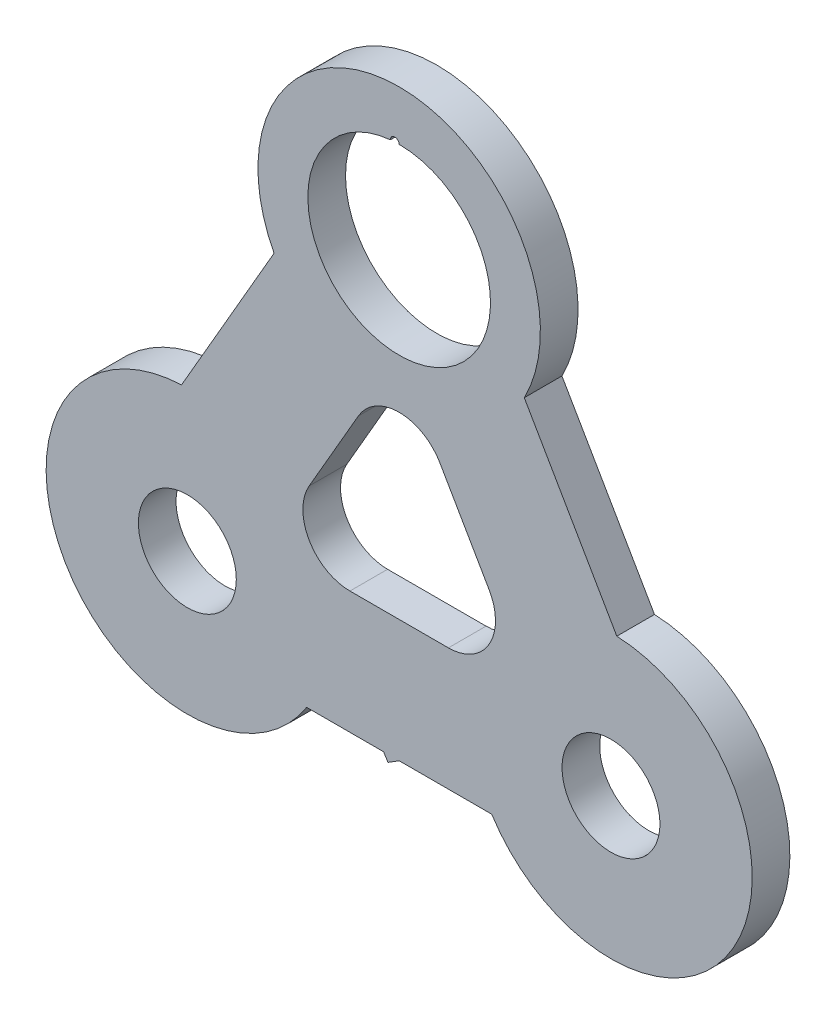
ISO-10303-21;
HEADER;
FILE_DESCRIPTION(('STEP AP214'),'2;1');
FILE_NAME('part.step','',(''),(''),'','','');
FILE_SCHEMA(('AUTOMOTIVE_DESIGN { 1 0 10303 214 1 1 1 1 }'));
ENDSEC;
DATA;
#1=APPLICATION_CONTEXT('core data for automotive mechanical design processes');
#2=APPLICATION_PROTOCOL_DEFINITION('international standard','automotive_design',2000,#1);
#3=PRODUCT_CONTEXT('',#1,'mechanical');
#4=PRODUCT('Part','Part','',(#3));
#5=PRODUCT_RELATED_PRODUCT_CATEGORY('part','',(#4));
#6=PRODUCT_DEFINITION_FORMATION('','',#4);
#7=PRODUCT_DEFINITION_CONTEXT('part definition',#1,'design');
#8=PRODUCT_DEFINITION('design','',#6,#7);
#9=PRODUCT_DEFINITION_SHAPE('','',#8);
#10=(LENGTH_UNIT() NAMED_UNIT(*) SI_UNIT(.MILLI.,.METRE.));
#11=(NAMED_UNIT(*) PLANE_ANGLE_UNIT() SI_UNIT($,.RADIAN.));
#12=(NAMED_UNIT(*) SI_UNIT($,.STERADIAN.) SOLID_ANGLE_UNIT());
#13=UNCERTAINTY_MEASURE_WITH_UNIT(LENGTH_MEASURE(1.E-05),#10,'distance_accuracy_value','');
#14=(GEOMETRIC_REPRESENTATION_CONTEXT(3) GLOBAL_UNCERTAINTY_ASSIGNED_CONTEXT((#13)) GLOBAL_UNIT_ASSIGNED_CONTEXT((#10,
#11,#12)) REPRESENTATION_CONTEXT('',''));
#15=CARTESIAN_POINT('',(0.,0.,0.));
#16=DIRECTION('',(0.,0.,1.));
#17=DIRECTION('',(1.,0.,0.));
#18=AXIS2_PLACEMENT_3D('',#15,#16,#17);
#19=CARTESIAN_POINT('',(-0.291428571428643,20.2141430137214,4.));
#20=DIRECTION('',(0.,0.,1.));
#21=DIRECTION('',(1.,0.,0.));
#22=AXIS2_PLACEMENT_3D('',#19,#20,#21);
#23=PLANE('',#22);
#24=CARTESIAN_POINT('',(-0.291428571428611,20.2141430137213,4.));
#25=DIRECTION('',(0.,0.,1.));
#26=DIRECTION('',(1.,0.,0.));
#27=AXIS2_PLACEMENT_3D('',#24,#25,#26);
#28=CIRCLE('',#27,9.70000000000008);
#29=CARTESIAN_POINT('',(-1.21777852383291,29.8698084887511,4.));
#30=VERTEX_POINT('',#29);
#31=CARTESIAN_POINT('',(-0.29142857142864,29.9141430137214,4.));
#32=VERTEX_POINT('',#31);
#33=EDGE_CURVE('E55',#30,#32,#28,.T.);
#34=ORIENTED_EDGE('',*,*,#33,.F.);
#35=CARTESIAN_POINT('',(-0.754603547630773,29.8919757512362,4.));
#36=DIRECTION('',(0.,0.,1.));
#37=DIRECTION('',(1.,0.,0.));
#38=AXIS2_PLACEMENT_3D('',#35,#36,#37);
#39=CIRCLE('',#38,0.463705128401587);
#40=EDGE_CURVE('E173',#32,#30,#39,.T.);
#41=ORIENTED_EDGE('',*,*,#40,.F.);
#42=EDGE_LOOP('',(#34,#41));
#43=FACE_BOUND('',#42,.T.);
#44=CARTESIAN_POINT('',(22.2085714285714,-18.7570001565784,4.));
#45=DIRECTION('',(0.,0.,1.));
#46=DIRECTION('',(1.,0.,0.));
#47=AXIS2_PLACEMENT_3D('',#44,#45,#46);
#48=CIRCLE('',#47,5.2);
#49=CARTESIAN_POINT('',(27.4085714285714,-18.7570001565784,4.));
#50=VERTEX_POINT('',#49);
#51=EDGE_CURVE('E254',#50,#50,#48,.T.);
#52=ORIENTED_EDGE('',*,*,#51,.F.);
#53=EDGE_LOOP('',(#52));
#54=FACE_BOUND('',#53,.T.);
#55=DIRECTION('',(-0.500000000000004,-0.866025403784436,0.));
#56=VECTOR('',#55,1.);
#57=CARTESIAN_POINT('',(-18.4946225492973,4.74299984342158,4.));
#58=LINE('',#57,#56);
#59=CARTESIAN_POINT('',(-13.579791410665,13.2557370861542,4.));
#60=VERTEX_POINT('',#59);
#61=CARTESIAN_POINT('',(-23.4094536879295,-3.76973739931099,4.));
#62=VERTEX_POINT('',#61);
#63=EDGE_CURVE('E262',#60,#62,#58,.T.);
#64=ORIENTED_EDGE('',*,*,#63,.T.);
#65=CARTESIAN_POINT('',(-22.7914285714286,-18.7570001565784,4.));
#66=DIRECTION('',(0.,0.,1.));
#67=DIRECTION('',(-1.,0.,0.));
#68=AXIS2_PLACEMENT_3D('',#65,#66,#67);
#69=CIRCLE('',#68,15.);
#70=CARTESIAN_POINT('',(-10.1210908486931,-26.7858569862786,4.));
#71=VERTEX_POINT('',#70);
#72=EDGE_CURVE('E265',#62,#71,#69,.T.);
#73=ORIENTED_EDGE('',*,*,#72,.T.);
#74=DIRECTION('',(1.,0.,0.));
#75=VECTOR('',#74,1.);
#76=CARTESIAN_POINT('',(-1.94731162959737,-26.7858569862786,4.));
#77=LINE('',#76,#75);
#78=CARTESIAN_POINT('',(-1.94731162959737,-26.7858569862786,4.));
#79=VERTEX_POINT('',#78);
#80=EDGE_CURVE('E269',#71,#79,#77,.T.);
#81=ORIENTED_EDGE('',*,*,#80,.T.);
#82=DIRECTION('',(0.531337840176272,-0.847160020065168,0.));
#83=VECTOR('',#82,1.);
#84=CARTESIAN_POINT('',(-1.47982288953585,-27.531216605837,4.));
#85=LINE('',#84,#83);
#86=CARTESIAN_POINT('',(-1.47982288953585,-27.531216605837,4.));
#87=VERTEX_POINT('',#86);
#88=EDGE_CURVE('E272',#79,#87,#85,.T.);
#89=ORIENTED_EDGE('',*,*,#88,.T.);
#90=DIRECTION('',(0.847160020065167,0.531337840176272,0.));
#91=VECTOR('',#90,1.);
#92=CARTESIAN_POINT('',(-0.291428571428633,-26.7858569862786,4.));
#93=LINE('',#92,#91);
#94=CARTESIAN_POINT('',(-0.291428571428633,-26.7858569862786,4.));
#95=VERTEX_POINT('',#94);
#96=EDGE_CURVE('E275',#87,#95,#93,.T.);
#97=ORIENTED_EDGE('',*,*,#96,.T.);
#98=DIRECTION('',(1.,0.,0.));
#99=VECTOR('',#98,1.);
#100=CARTESIAN_POINT('',(-0.291428571428633,-26.7858569862786,4.));
#101=LINE('',#100,#99);
#102=CARTESIAN_POINT('',(9.53823370583582,-26.7858569862786,4.));
#103=VERTEX_POINT('',#102);
#104=EDGE_CURVE('E278',#95,#103,#101,.T.);
#105=ORIENTED_EDGE('',*,*,#104,.T.);
#106=CARTESIAN_POINT('',(22.2085714285715,-18.7570001565784,4.));
#107=DIRECTION('',(0.,0.,1.));
#108=DIRECTION('',(-1.,0.,0.));
#109=AXIS2_PLACEMENT_3D('',#106,#107,#108);
#110=CIRCLE('',#109,15.0000000000001);
#111=CARTESIAN_POINT('',(22.8265965450723,-3.76973739931098,4.));
#112=VERTEX_POINT('',#111);
#113=EDGE_CURVE('E281',#103,#112,#110,.T.);
#114=ORIENTED_EDGE('',*,*,#113,.T.);
#115=DIRECTION('',(-0.500000000000005,0.866025403784436,0.));
#116=VECTOR('',#115,1.);
#117=CARTESIAN_POINT('',(17.91176540644,4.74299984342158,4.));
#118=LINE('',#117,#116);
#119=CARTESIAN_POINT('',(12.9969342678077,13.2557370861542,4.));
#120=VERTEX_POINT('',#119);
#121=EDGE_CURVE('E284',#112,#120,#118,.T.);
#122=ORIENTED_EDGE('',*,*,#121,.T.);
#123=CARTESIAN_POINT('',(-0.291428571428643,20.2141430137214,4.));
#124=DIRECTION('',(0.,0.,1.));
#125=DIRECTION('',(1.,0.,0.));
#126=AXIS2_PLACEMENT_3D('',#123,#124,#125);
#127=CIRCLE('',#126,15.);
#128=EDGE_CURVE('E287',#120,#60,#127,.T.);
#129=ORIENTED_EDGE('',*,*,#128,.T.);
#130=EDGE_LOOP('',(#64,#73,#81,#89,#97,#105,#114,#122,#129));
#131=FACE_BOUND('',#130,.T.);
#132=CARTESIAN_POINT('',(-22.7914285714286,-18.7570001565784,4.));
#133=DIRECTION('',(0.,0.,1.));
#134=DIRECTION('',(1.,0.,0.));
#135=AXIS2_PLACEMENT_3D('',#132,#133,#134);
#136=CIRCLE('',#135,5.2);
#137=CARTESIAN_POINT('',(-17.5914285714286,-18.7570001565784,4.));
#138=VERTEX_POINT('',#137);
#139=EDGE_CURVE('E246',#138,#138,#136,.T.);
#140=ORIENTED_EDGE('',*,*,#139,.F.);
#141=EDGE_LOOP('',(#140));
#142=FACE_BOUND('',#141,.T.);
#143=DIRECTION('',(-0.500000000000004,0.866025403784436,0.));
#144=VECTOR('',#143,1.);
#145=CARTESIAN_POINT('',(9.26817186699101,-6.28585698627862,4.));
#146=LINE('',#145,#144);
#147=CARTESIAN_POINT('',(9.26817186699101,-6.28585698627862,4.));
#148=VERTEX_POINT('',#147);
#149=CARTESIAN_POINT('',(4.03869844749354,2.77185667312186,4.));
#150=VERTEX_POINT('',#149);
#151=EDGE_CURVE('E186',#148,#150,#146,.T.);
#152=ORIENTED_EDGE('',*,*,#151,.F.);
#153=CARTESIAN_POINT('',(4.9380448480688,-8.78585698627862,4.));
#154=DIRECTION('',(0.,0.,1.));
#155=DIRECTION('',(1.,0.,0.));
#156=AXIS2_PLACEMENT_3D('',#153,#154,#155);
#157=CIRCLE('',#156,5.00000000000002);
#158=CARTESIAN_POINT('',(4.93804484806883,-13.7858569862786,4.));
#159=VERTEX_POINT('',#158);
#160=EDGE_CURVE('E183',#159,#148,#157,.T.);
#161=ORIENTED_EDGE('',*,*,#160,.F.);
#162=DIRECTION('',(1.,0.,0.));
#163=VECTOR('',#162,1.);
#164=CARTESIAN_POINT('',(4.93804484806883,-13.7858569862786,4.));
#165=LINE('',#164,#163);
#166=CARTESIAN_POINT('',(-5.52090199092611,-13.7858569862786,4.));
#167=VERTEX_POINT('',#166);
#168=EDGE_CURVE('E200',#167,#159,#165,.T.);
#169=ORIENTED_EDGE('',*,*,#168,.F.);
#170=CARTESIAN_POINT('',(-5.5209019909261,-8.78585698627863,4.));
#171=DIRECTION('',(0.,0.,1.));
#172=DIRECTION('',(-1.,0.,0.));
#173=AXIS2_PLACEMENT_3D('',#170,#171,#172);
#174=CIRCLE('',#173,5.);
#175=CARTESIAN_POINT('',(-9.85102900984829,-6.28585698627862,4.));
#176=VERTEX_POINT('',#175);
#177=EDGE_CURVE('E196',#176,#167,#174,.T.);
#178=ORIENTED_EDGE('',*,*,#177,.F.);
#179=DIRECTION('',(-0.500000000000004,-0.866025403784436,0.));
#180=VECTOR('',#179,1.);
#181=CARTESIAN_POINT('',(-4.62155559035082,2.77185667312185,4.));
#182=LINE('',#181,#180);
#183=CARTESIAN_POINT('',(-4.62155559035083,2.77185667312185,4.));
#184=VERTEX_POINT('',#183);
#185=EDGE_CURVE('E193',#184,#176,#182,.T.);
#186=ORIENTED_EDGE('',*,*,#185,.F.);
#187=CARTESIAN_POINT('',(-0.291428571428639,0.271856673121823,4.));
#188=DIRECTION('',(0.,0.,1.));
#189=DIRECTION('',(1.,0.,0.));
#190=AXIS2_PLACEMENT_3D('',#187,#188,#189);
#191=CIRCLE('',#190,5.00000000000001);
#192=EDGE_CURVE('E190',#150,#184,#191,.T.);
#193=ORIENTED_EDGE('',*,*,#192,.F.);
#194=EDGE_LOOP('',(#152,#161,#169,#178,#186,#193));
#195=FACE_BOUND('',#194,.T.);
#196=ADVANCED_FACE('F39',(#43,#54,#131,#142,#195),#23,.T.);
#197=CARTESIAN_POINT('',(-0.291428571428643,20.2141430137214,0.));
#198=DIRECTION('',(0.,0.,1.));
#199=DIRECTION('',(1.,0.,0.));
#200=AXIS2_PLACEMENT_3D('',#197,#198,#199);
#201=PLANE('',#200);
#202=CARTESIAN_POINT('',(-0.754603547630773,29.8919757512362,0.));
#203=DIRECTION('',(0.,0.,1.));
#204=DIRECTION('',(1.,0.,0.));
#205=AXIS2_PLACEMENT_3D('',#202,#203,#204);
#206=CIRCLE('',#205,0.463705128401587);
#207=CARTESIAN_POINT('',(-0.29142857142864,29.9141430137214,0.));
#208=VERTEX_POINT('',#207);
#209=CARTESIAN_POINT('',(-1.21777852383291,29.8698084887511,0.));
#210=VERTEX_POINT('',#209);
#211=EDGE_CURVE('E163',#208,#210,#206,.T.);
#212=ORIENTED_EDGE('',*,*,#211,.T.);
#213=CARTESIAN_POINT('',(-0.291428571428611,20.2141430137213,0.));
#214=DIRECTION('',(0.,0.,1.));
#215=DIRECTION('',(1.,0.,0.));
#216=AXIS2_PLACEMENT_3D('',#213,#214,#215);
#217=CIRCLE('',#216,9.70000000000008);
#218=EDGE_CURVE('E60',#210,#208,#217,.T.);
#219=ORIENTED_EDGE('',*,*,#218,.T.);
#220=EDGE_LOOP('',(#212,#219));
#221=FACE_BOUND('',#220,.T.);
#222=CARTESIAN_POINT('',(-22.7914285714286,-18.7570001565784,0.));
#223=DIRECTION('',(0.,0.,1.));
#224=DIRECTION('',(1.,0.,0.));
#225=AXIS2_PLACEMENT_3D('',#222,#223,#224);
#226=CIRCLE('',#225,5.2);
#227=CARTESIAN_POINT('',(-17.5914285714286,-18.7570001565784,0.));
#228=VERTEX_POINT('',#227);
#229=EDGE_CURVE('E245',#228,#228,#226,.T.);
#230=ORIENTED_EDGE('',*,*,#229,.T.);
#231=EDGE_LOOP('',(#230));
#232=FACE_BOUND('',#231,.T.);
#233=CARTESIAN_POINT('',(22.2085714285714,-18.7570001565784,0.));
#234=DIRECTION('',(0.,0.,1.));
#235=DIRECTION('',(1.,0.,0.));
#236=AXIS2_PLACEMENT_3D('',#233,#234,#235);
#237=CIRCLE('',#236,5.2);
#238=CARTESIAN_POINT('',(27.4085714285714,-18.7570001565784,0.));
#239=VERTEX_POINT('',#238);
#240=EDGE_CURVE('E250',#239,#239,#237,.T.);
#241=ORIENTED_EDGE('',*,*,#240,.T.);
#242=EDGE_LOOP('',(#241));
#243=FACE_BOUND('',#242,.T.);
#244=DIRECTION('',(-0.500000000000004,-0.866025403784436,0.));
#245=VECTOR('',#244,1.);
#246=CARTESIAN_POINT('',(-18.4946225492973,4.74299984342158,0.));
#247=LINE('',#246,#245);
#248=CARTESIAN_POINT('',(-13.579791410665,13.2557370861542,0.));
#249=VERTEX_POINT('',#248);
#250=CARTESIAN_POINT('',(-23.4094536879295,-3.76973739931099,0.));
#251=VERTEX_POINT('',#250);
#252=EDGE_CURVE('E258',#249,#251,#247,.T.);
#253=ORIENTED_EDGE('',*,*,#252,.F.);
#254=CARTESIAN_POINT('',(-0.291428571428643,20.2141430137214,0.));
#255=DIRECTION('',(0.,0.,1.));
#256=DIRECTION('',(1.,0.,0.));
#257=AXIS2_PLACEMENT_3D('',#254,#255,#256);
#258=CIRCLE('',#257,15.);
#259=CARTESIAN_POINT('',(12.9969342678077,13.2557370861542,0.));
#260=VERTEX_POINT('',#259);
#261=EDGE_CURVE('E266',#260,#249,#258,.T.);
#262=ORIENTED_EDGE('',*,*,#261,.F.);
#263=DIRECTION('',(-0.500000000000005,0.866025403784436,0.));
#264=VECTOR('',#263,1.);
#265=CARTESIAN_POINT('',(17.91176540644,4.74299984342158,0.));
#266=LINE('',#265,#264);
#267=CARTESIAN_POINT('',(22.8265965450723,-3.76973739931098,0.));
#268=VERTEX_POINT('',#267);
#269=EDGE_CURVE('E312',#268,#260,#266,.T.);
#270=ORIENTED_EDGE('',*,*,#269,.F.);
#271=CARTESIAN_POINT('',(22.2085714285715,-18.7570001565784,0.));
#272=DIRECTION('',(0.,0.,1.));
#273=DIRECTION('',(-1.,0.,0.));
#274=AXIS2_PLACEMENT_3D('',#271,#272,#273);
#275=CIRCLE('',#274,15.0000000000001);
#276=CARTESIAN_POINT('',(9.53823370583582,-26.7858569862786,0.));
#277=VERTEX_POINT('',#276);
#278=EDGE_CURVE('E308',#277,#268,#275,.T.);
#279=ORIENTED_EDGE('',*,*,#278,.F.);
#280=DIRECTION('',(1.,0.,0.));
#281=VECTOR('',#280,1.);
#282=CARTESIAN_POINT('',(-0.291428571428633,-26.7858569862786,0.));
#283=LINE('',#282,#281);
#284=CARTESIAN_POINT('',(-0.291428571428633,-26.7858569862786,0.));
#285=VERTEX_POINT('',#284);
#286=EDGE_CURVE('E305',#285,#277,#283,.T.);
#287=ORIENTED_EDGE('',*,*,#286,.F.);
#288=DIRECTION('',(0.847160020065167,0.531337840176272,0.));
#289=VECTOR('',#288,1.);
#290=CARTESIAN_POINT('',(-0.291428571428633,-26.7858569862786,0.));
#291=LINE('',#290,#289);
#292=CARTESIAN_POINT('',(-1.47982288953585,-27.531216605837,0.));
#293=VERTEX_POINT('',#292);
#294=EDGE_CURVE('E302',#293,#285,#291,.T.);
#295=ORIENTED_EDGE('',*,*,#294,.F.);
#296=DIRECTION('',(0.531337840176272,-0.847160020065168,0.));
#297=VECTOR('',#296,1.);
#298=CARTESIAN_POINT('',(-1.47982288953585,-27.531216605837,0.));
#299=LINE('',#298,#297);
#300=CARTESIAN_POINT('',(-1.94731162959737,-26.7858569862786,0.));
#301=VERTEX_POINT('',#300);
#302=EDGE_CURVE('E299',#301,#293,#299,.T.);
#303=ORIENTED_EDGE('',*,*,#302,.F.);
#304=DIRECTION('',(1.,0.,0.));
#305=VECTOR('',#304,1.);
#306=CARTESIAN_POINT('',(-1.94731162959737,-26.7858569862786,0.));
#307=LINE('',#306,#305);
#308=CARTESIAN_POINT('',(-10.1210908486931,-26.7858569862786,0.));
#309=VERTEX_POINT('',#308);
#310=EDGE_CURVE('E296',#309,#301,#307,.T.);
#311=ORIENTED_EDGE('',*,*,#310,.F.);
#312=CARTESIAN_POINT('',(-22.7914285714286,-18.7570001565784,0.));
#313=DIRECTION('',(0.,0.,1.));
#314=DIRECTION('',(-1.,0.,0.));
#315=AXIS2_PLACEMENT_3D('',#312,#313,#314);
#316=CIRCLE('',#315,15.);
#317=EDGE_CURVE('E293',#251,#309,#316,.T.);
#318=ORIENTED_EDGE('',*,*,#317,.F.);
#319=EDGE_LOOP('',(#253,#262,#270,#279,#287,#295,#303,#311,#318));
#320=FACE_BOUND('',#319,.T.);
#321=CARTESIAN_POINT('',(4.9380448480688,-8.78585698627862,0.));
#322=DIRECTION('',(0.,0.,1.));
#323=DIRECTION('',(1.,0.,0.));
#324=AXIS2_PLACEMENT_3D('',#321,#322,#323);
#325=CIRCLE('',#324,5.00000000000002);
#326=CARTESIAN_POINT('',(4.93804484806883,-13.7858569862786,0.));
#327=VERTEX_POINT('',#326);
#328=CARTESIAN_POINT('',(9.26817186699101,-6.28585698627862,0.));
#329=VERTEX_POINT('',#328);
#330=EDGE_CURVE('E181',#327,#329,#325,.T.);
#331=ORIENTED_EDGE('',*,*,#330,.T.);
#332=DIRECTION('',(-0.500000000000004,0.866025403784436,0.));
#333=VECTOR('',#332,1.);
#334=CARTESIAN_POINT('',(9.26817186699101,-6.28585698627862,0.));
#335=LINE('',#334,#333);
#336=CARTESIAN_POINT('',(4.03869844749354,2.77185667312186,0.));
#337=VERTEX_POINT('',#336);
#338=EDGE_CURVE('E207',#329,#337,#335,.T.);
#339=ORIENTED_EDGE('',*,*,#338,.T.);
#340=CARTESIAN_POINT('',(-0.291428571428639,0.271856673121823,0.));
#341=DIRECTION('',(0.,0.,1.));
#342=DIRECTION('',(1.,0.,0.));
#343=AXIS2_PLACEMENT_3D('',#340,#341,#342);
#344=CIRCLE('',#343,5.00000000000001);
#345=CARTESIAN_POINT('',(-4.62155559035083,2.77185667312185,0.));
#346=VERTEX_POINT('',#345);
#347=EDGE_CURVE('E211',#337,#346,#344,.T.);
#348=ORIENTED_EDGE('',*,*,#347,.T.);
#349=DIRECTION('',(-0.500000000000004,-0.866025403784436,0.));
#350=VECTOR('',#349,1.);
#351=CARTESIAN_POINT('',(-4.62155559035082,2.77185667312185,0.));
#352=LINE('',#351,#350);
#353=CARTESIAN_POINT('',(-9.85102900984829,-6.28585698627862,0.));
#354=VERTEX_POINT('',#353);
#355=EDGE_CURVE('E215',#346,#354,#352,.T.);
#356=ORIENTED_EDGE('',*,*,#355,.T.);
#357=CARTESIAN_POINT('',(-5.5209019909261,-8.78585698627863,0.));
#358=DIRECTION('',(0.,0.,1.));
#359=DIRECTION('',(-1.,0.,0.));
#360=AXIS2_PLACEMENT_3D('',#357,#358,#359);
#361=CIRCLE('',#360,5.);
#362=CARTESIAN_POINT('',(-5.52090199092611,-13.7858569862786,0.));
#363=VERTEX_POINT('',#362);
#364=EDGE_CURVE('E219',#354,#363,#361,.T.);
#365=ORIENTED_EDGE('',*,*,#364,.T.);
#366=DIRECTION('',(1.,0.,0.));
#367=VECTOR('',#366,1.);
#368=CARTESIAN_POINT('',(4.93804484806883,-13.7858569862786,0.));
#369=LINE('',#368,#367);
#370=EDGE_CURVE('E187',#363,#327,#369,.T.);
#371=ORIENTED_EDGE('',*,*,#370,.T.);
#372=EDGE_LOOP('',(#331,#339,#348,#356,#365,#371));
#373=FACE_BOUND('',#372,.T.);
#374=ADVANCED_FACE('F170',(#221,#232,#243,#320,#373),#201,.F.);
#375=CARTESIAN_POINT('',(-18.4946225492973,4.74299984342158,4.));
#376=DIRECTION('',(0.866025403784436,-0.500000000000004,0.));
#377=DIRECTION('',(0.500000000000004,0.866025403784436,0.));
#378=AXIS2_PLACEMENT_3D('',#375,#376,#377);
#379=PLANE('',#378);
#380=ORIENTED_EDGE('',*,*,#252,.T.);
#381=DIRECTION('',(0.,0.,-1.));
#382=VECTOR('',#381,1.);
#383=CARTESIAN_POINT('',(-23.4094536879295,-3.76973739931099,4.));
#384=LINE('',#383,#382);
#385=EDGE_CURVE('E11',#62,#251,#384,.T.);
#386=ORIENTED_EDGE('',*,*,#385,.F.);
#387=ORIENTED_EDGE('',*,*,#63,.F.);
#388=DIRECTION('',(0.,0.,-1.));
#389=VECTOR('',#388,1.);
#390=CARTESIAN_POINT('',(-13.579791410665,13.2557370861542,4.));
#391=LINE('',#390,#389);
#392=EDGE_CURVE('E290',#60,#249,#391,.T.);
#393=ORIENTED_EDGE('',*,*,#392,.T.);
#394=EDGE_LOOP('',(#380,#386,#387,#393));
#395=FACE_BOUND('',#394,.T.);
#396=ADVANCED_FACE('F41',(#395),#379,.F.);
#397=CARTESIAN_POINT('',(-22.7914285714286,-18.7570001565784,4.));
#398=DIRECTION('',(0.,0.,-1.));
#399=DIRECTION('',(-1.,0.,0.));
#400=AXIS2_PLACEMENT_3D('',#397,#398,#399);
#401=CYLINDRICAL_SURFACE('',#400,15.);
#402=ORIENTED_EDGE('',*,*,#317,.T.);
#403=DIRECTION('',(0.,0.,-1.));
#404=VECTOR('',#403,1.);
#405=CARTESIAN_POINT('',(-10.1210908486931,-26.7858569862786,4.));
#406=LINE('',#405,#404);
#407=EDGE_CURVE('E48',#71,#309,#406,.T.);
#408=ORIENTED_EDGE('',*,*,#407,.F.);
#409=ORIENTED_EDGE('',*,*,#72,.F.);
#410=ORIENTED_EDGE('',*,*,#385,.T.);
#411=EDGE_LOOP('',(#402,#408,#409,#410));
#412=FACE_BOUND('',#411,.T.);
#413=ADVANCED_FACE('F374',(#412),#401,.T.);
#414=CARTESIAN_POINT('',(-1.94731162959737,-26.7858569862786,4.));
#415=DIRECTION('',(0.,1.,0.));
#416=DIRECTION('',(0.,0.,1.));
#417=AXIS2_PLACEMENT_3D('',#414,#415,#416);
#418=PLANE('',#417);
#419=ORIENTED_EDGE('',*,*,#310,.T.);
#420=DIRECTION('',(0.,0.,-1.));
#421=VECTOR('',#420,1.);
#422=CARTESIAN_POINT('',(-1.94731162959737,-26.7858569862786,4.));
#423=LINE('',#422,#421);
#424=EDGE_CURVE('E341',#79,#301,#423,.T.);
#425=ORIENTED_EDGE('',*,*,#424,.F.);
#426=ORIENTED_EDGE('',*,*,#80,.F.);
#427=ORIENTED_EDGE('',*,*,#407,.T.);
#428=EDGE_LOOP('',(#419,#425,#426,#427));
#429=FACE_BOUND('',#428,.T.);
#430=ADVANCED_FACE('F350',(#429),#418,.F.);
#431=CARTESIAN_POINT('',(-1.47982288953585,-27.531216605837,4.));
#432=DIRECTION('',(0.847160020065167,0.531337840176271,0.));
#433=DIRECTION('',(-0.531337840176272,0.847160020065168,0.));
#434=AXIS2_PLACEMENT_3D('',#431,#432,#433);
#435=PLANE('',#434);
#436=ORIENTED_EDGE('',*,*,#302,.T.);
#437=DIRECTION('',(0.,0.,-1.));
#438=VECTOR('',#437,1.);
#439=CARTESIAN_POINT('',(-1.47982288953585,-27.531216605837,4.));
#440=LINE('',#439,#438);
#441=EDGE_CURVE('E337',#87,#293,#440,.T.);
#442=ORIENTED_EDGE('',*,*,#441,.F.);
#443=ORIENTED_EDGE('',*,*,#88,.F.);
#444=ORIENTED_EDGE('',*,*,#424,.T.);
#445=EDGE_LOOP('',(#436,#442,#443,#444));
#446=FACE_BOUND('',#445,.T.);
#447=ADVANCED_FACE('F362',(#446),#435,.F.);
#448=CARTESIAN_POINT('',(-0.291428571428633,-26.7858569862786,4.));
#449=DIRECTION('',(-0.531337840176272,0.847160020065167,0.));
#450=DIRECTION('',(-0.847160020065167,-0.531337840176272,0.));
#451=AXIS2_PLACEMENT_3D('',#448,#449,#450);
#452=PLANE('',#451);
#453=ORIENTED_EDGE('',*,*,#294,.T.);
#454=DIRECTION('',(0.,0.,-1.));
#455=VECTOR('',#454,1.);
#456=CARTESIAN_POINT('',(-0.291428571428633,-26.7858569862786,4.));
#457=LINE('',#456,#455);
#458=EDGE_CURVE('E333',#95,#285,#457,.T.);
#459=ORIENTED_EDGE('',*,*,#458,.F.);
#460=ORIENTED_EDGE('',*,*,#96,.F.);
#461=ORIENTED_EDGE('',*,*,#441,.T.);
#462=EDGE_LOOP('',(#453,#459,#460,#461));
#463=FACE_BOUND('',#462,.T.);
#464=ADVANCED_FACE('F366',(#463),#452,.F.);
#465=CARTESIAN_POINT('',(-0.291428571428633,-26.7858569862786,4.));
#466=DIRECTION('',(0.,1.,0.));
#467=DIRECTION('',(0.,0.,1.));
#468=AXIS2_PLACEMENT_3D('',#465,#466,#467);
#469=PLANE('',#468);
#470=ORIENTED_EDGE('',*,*,#286,.T.);
#471=DIRECTION('',(0.,0.,-1.));
#472=VECTOR('',#471,1.);
#473=CARTESIAN_POINT('',(9.53823370583582,-26.7858569862786,4.));
#474=LINE('',#473,#472);
#475=EDGE_CURVE('E329',#103,#277,#474,.T.);
#476=ORIENTED_EDGE('',*,*,#475,.F.);
#477=ORIENTED_EDGE('',*,*,#104,.F.);
#478=ORIENTED_EDGE('',*,*,#458,.T.);
#479=EDGE_LOOP('',(#470,#476,#477,#478));
#480=FACE_BOUND('',#479,.T.);
#481=ADVANCED_FACE('F391',(#480),#469,.F.);
#482=CARTESIAN_POINT('',(22.2085714285715,-18.7570001565784,4.));
#483=DIRECTION('',(0.,0.,-1.));
#484=DIRECTION('',(-1.,0.,0.));
#485=AXIS2_PLACEMENT_3D('',#482,#483,#484);
#486=CYLINDRICAL_SURFACE('',#485,15.0000000000001);
#487=ORIENTED_EDGE('',*,*,#278,.T.);
#488=DIRECTION('',(0.,0.,-1.));
#489=VECTOR('',#488,1.);
#490=CARTESIAN_POINT('',(22.8265965450723,-3.76973739931098,4.));
#491=LINE('',#490,#489);
#492=EDGE_CURVE('E325',#112,#268,#491,.T.);
#493=ORIENTED_EDGE('',*,*,#492,.F.);
#494=ORIENTED_EDGE('',*,*,#113,.F.);
#495=ORIENTED_EDGE('',*,*,#475,.T.);
#496=EDGE_LOOP('',(#487,#493,#494,#495));
#497=FACE_BOUND('',#496,.T.);
#498=ADVANCED_FACE('F388',(#497),#486,.T.);
#499=CARTESIAN_POINT('',(17.91176540644,4.74299984342158,4.));
#500=DIRECTION('',(-0.866025403784436,-0.500000000000005,0.));
#501=DIRECTION('',(0.500000000000005,-0.866025403784436,0.));
#502=AXIS2_PLACEMENT_3D('',#499,#500,#501);
#503=PLANE('',#502);
#504=ORIENTED_EDGE('',*,*,#269,.T.);
#505=DIRECTION('',(0.,0.,-1.));
#506=VECTOR('',#505,1.);
#507=CARTESIAN_POINT('',(12.9969342678077,13.2557370861542,4.));
#508=LINE('',#507,#506);
#509=EDGE_CURVE('E321',#120,#260,#508,.T.);
#510=ORIENTED_EDGE('',*,*,#509,.F.);
#511=ORIENTED_EDGE('',*,*,#121,.F.);
#512=ORIENTED_EDGE('',*,*,#492,.T.);
#513=EDGE_LOOP('',(#504,#510,#511,#512));
#514=FACE_BOUND('',#513,.T.);
#515=ADVANCED_FACE('F384',(#514),#503,.F.);
#516=CARTESIAN_POINT('',(-0.291428571428643,20.2141430137214,4.));
#517=DIRECTION('',(0.,0.,-1.));
#518=DIRECTION('',(-1.,0.,0.));
#519=AXIS2_PLACEMENT_3D('',#516,#517,#518);
#520=CYLINDRICAL_SURFACE('',#519,15.);
#521=ORIENTED_EDGE('',*,*,#261,.T.);
#522=ORIENTED_EDGE('',*,*,#392,.F.);
#523=ORIENTED_EDGE('',*,*,#128,.F.);
#524=ORIENTED_EDGE('',*,*,#509,.T.);
#525=EDGE_LOOP('',(#521,#522,#523,#524));
#526=FACE_BOUND('',#525,.T.);
#527=ADVANCED_FACE('F379',(#526),#520,.T.);
#528=CARTESIAN_POINT('',(22.2085714285714,-18.7570001565784,4.));
#529=DIRECTION('',(0.,0.,-1.));
#530=DIRECTION('',(-1.,0.,0.));
#531=AXIS2_PLACEMENT_3D('',#528,#529,#530);
#532=CYLINDRICAL_SURFACE('',#531,5.2);
#533=ORIENTED_EDGE('',*,*,#51,.T.);
#534=EDGE_LOOP('',(#533));
#535=FACE_BOUND('',#534,.T.);
#536=ORIENTED_EDGE('',*,*,#240,.F.);
#537=EDGE_LOOP('',(#536));
#538=FACE_BOUND('',#537,.T.);
#539=ADVANCED_FACE('F409',(#535,#538),#532,.F.);
#540=CARTESIAN_POINT('',(-22.7914285714286,-18.7570001565784,4.));
#541=DIRECTION('',(0.,0.,-1.));
#542=DIRECTION('',(-1.,0.,0.));
#543=AXIS2_PLACEMENT_3D('',#540,#541,#542);
#544=CYLINDRICAL_SURFACE('',#543,5.2);
#545=ORIENTED_EDGE('',*,*,#139,.T.);
#546=EDGE_LOOP('',(#545));
#547=FACE_BOUND('',#546,.T.);
#548=ORIENTED_EDGE('',*,*,#229,.F.);
#549=EDGE_LOOP('',(#548));
#550=FACE_BOUND('',#549,.T.);
#551=ADVANCED_FACE('F429',(#547,#550),#544,.F.);
#552=CARTESIAN_POINT('',(4.9380448480688,-8.78585698627862,4.));
#553=DIRECTION('',(0.,0.,-1.));
#554=DIRECTION('',(-1.,0.,0.));
#555=AXIS2_PLACEMENT_3D('',#552,#553,#554);
#556=CYLINDRICAL_SURFACE('',#555,5.00000000000002);
#557=ORIENTED_EDGE('',*,*,#330,.F.);
#558=DIRECTION('',(0.,0.,-1.));
#559=VECTOR('',#558,1.);
#560=CARTESIAN_POINT('',(4.93804484806883,-13.7858569862786,4.));
#561=LINE('',#560,#559);
#562=EDGE_CURVE('E203',#159,#327,#561,.T.);
#563=ORIENTED_EDGE('',*,*,#562,.F.);
#564=ORIENTED_EDGE('',*,*,#160,.T.);
#565=DIRECTION('',(0.,0.,-1.));
#566=VECTOR('',#565,1.);
#567=CARTESIAN_POINT('',(9.26817186699101,-6.28585698627862,4.));
#568=LINE('',#567,#566);
#569=EDGE_CURVE('E241',#148,#329,#568,.T.);
#570=ORIENTED_EDGE('',*,*,#569,.T.);
#571=EDGE_LOOP('',(#557,#563,#564,#570));
#572=FACE_BOUND('',#571,.T.);
#573=ADVANCED_FACE('F436',(#572),#556,.F.);
#574=CARTESIAN_POINT('',(9.26817186699101,-6.28585698627862,4.));
#575=DIRECTION('',(-0.866025403784436,-0.500000000000004,0.));
#576=DIRECTION('',(0.500000000000004,-0.866025403784437,0.));
#577=AXIS2_PLACEMENT_3D('',#574,#575,#576);
#578=PLANE('',#577);
#579=ORIENTED_EDGE('',*,*,#338,.F.);
#580=ORIENTED_EDGE('',*,*,#569,.F.);
#581=ORIENTED_EDGE('',*,*,#151,.T.);
#582=DIRECTION('',(0.,0.,-1.));
#583=VECTOR('',#582,1.);
#584=CARTESIAN_POINT('',(4.03869844749354,2.77185667312186,4.));
#585=LINE('',#584,#583);
#586=EDGE_CURVE('E238',#150,#337,#585,.T.);
#587=ORIENTED_EDGE('',*,*,#586,.T.);
#588=EDGE_LOOP('',(#579,#580,#581,#587));
#589=FACE_BOUND('',#588,.T.);
#590=ADVANCED_FACE('F443',(#589),#578,.T.);
#591=CARTESIAN_POINT('',(-0.291428571428639,0.271856673121823,4.));
#592=DIRECTION('',(0.,0.,-1.));
#593=DIRECTION('',(-1.,0.,0.));
#594=AXIS2_PLACEMENT_3D('',#591,#592,#593);
#595=CYLINDRICAL_SURFACE('',#594,5.00000000000001);
#596=ORIENTED_EDGE('',*,*,#347,.F.);
#597=ORIENTED_EDGE('',*,*,#586,.F.);
#598=ORIENTED_EDGE('',*,*,#192,.T.);
#599=DIRECTION('',(0.,0.,-1.));
#600=VECTOR('',#599,1.);
#601=CARTESIAN_POINT('',(-4.62155559035083,2.77185667312185,4.));
#602=LINE('',#601,#600);
#603=EDGE_CURVE('E235',#184,#346,#602,.T.);
#604=ORIENTED_EDGE('',*,*,#603,.T.);
#605=EDGE_LOOP('',(#596,#597,#598,#604));
#606=FACE_BOUND('',#605,.T.);
#607=ADVANCED_FACE('F451',(#606),#595,.F.);
#608=CARTESIAN_POINT('',(-4.62155559035082,2.77185667312185,4.));
#609=DIRECTION('',(0.866025403784436,-0.500000000000004,0.));
#610=DIRECTION('',(0.500000000000004,0.866025403784437,0.));
#611=AXIS2_PLACEMENT_3D('',#608,#609,#610);
#612=PLANE('',#611);
#613=ORIENTED_EDGE('',*,*,#355,.F.);
#614=ORIENTED_EDGE('',*,*,#603,.F.);
#615=ORIENTED_EDGE('',*,*,#185,.T.);
#616=DIRECTION('',(0.,0.,-1.));
#617=VECTOR('',#616,1.);
#618=CARTESIAN_POINT('',(-9.85102900984829,-6.28585698627862,4.));
#619=LINE('',#618,#617);
#620=EDGE_CURVE('E232',#176,#354,#619,.T.);
#621=ORIENTED_EDGE('',*,*,#620,.T.);
#622=EDGE_LOOP('',(#613,#614,#615,#621));
#623=FACE_BOUND('',#622,.T.);
#624=ADVANCED_FACE('F459',(#623),#612,.T.);
#625=CARTESIAN_POINT('',(-5.5209019909261,-8.78585698627863,4.));
#626=DIRECTION('',(0.,0.,-1.));
#627=DIRECTION('',(-1.,0.,0.));
#628=AXIS2_PLACEMENT_3D('',#625,#626,#627);
#629=CYLINDRICAL_SURFACE('',#628,5.);
#630=ORIENTED_EDGE('',*,*,#364,.F.);
#631=ORIENTED_EDGE('',*,*,#620,.F.);
#632=ORIENTED_EDGE('',*,*,#177,.T.);
#633=DIRECTION('',(0.,0.,-1.));
#634=VECTOR('',#633,1.);
#635=CARTESIAN_POINT('',(-5.52090199092611,-13.7858569862786,4.));
#636=LINE('',#635,#634);
#637=EDGE_CURVE('E229',#167,#363,#636,.T.);
#638=ORIENTED_EDGE('',*,*,#637,.T.);
#639=EDGE_LOOP('',(#630,#631,#632,#638));
#640=FACE_BOUND('',#639,.T.);
#641=ADVANCED_FACE('F467',(#640),#629,.F.);
#642=CARTESIAN_POINT('',(4.93804484806883,-13.7858569862786,4.));
#643=DIRECTION('',(0.,1.,0.));
#644=DIRECTION('',(0.,0.,1.));
#645=AXIS2_PLACEMENT_3D('',#642,#643,#644);
#646=PLANE('',#645);
#647=ORIENTED_EDGE('',*,*,#370,.F.);
#648=ORIENTED_EDGE('',*,*,#637,.F.);
#649=ORIENTED_EDGE('',*,*,#168,.T.);
#650=ORIENTED_EDGE('',*,*,#562,.T.);
#651=EDGE_LOOP('',(#647,#648,#649,#650));
#652=FACE_BOUND('',#651,.T.);
#653=ADVANCED_FACE('F475',(#652),#646,.T.);
#654=CARTESIAN_POINT('',(-0.291428571428611,20.2141430137213,0.));
#655=DIRECTION('',(0.,0.,1.));
#656=DIRECTION('',(1.,0.,0.));
#657=AXIS2_PLACEMENT_3D('',#654,#655,#656);
#658=CYLINDRICAL_SURFACE('',#657,9.70000000000008);
#659=ORIENTED_EDGE('',*,*,#33,.T.);
#660=DIRECTION('',(0.,0.,1.));
#661=VECTOR('',#660,1.);
#662=CARTESIAN_POINT('',(-0.29142857142864,29.9141430137214,0.));
#663=LINE('',#662,#661);
#664=EDGE_CURVE('E155',#208,#32,#663,.T.);
#665=ORIENTED_EDGE('',*,*,#664,.F.);
#666=ORIENTED_EDGE('',*,*,#218,.F.);
#667=DIRECTION('',(0.,0.,1.));
#668=VECTOR('',#667,1.);
#669=CARTESIAN_POINT('',(-1.21777852383291,29.8698084887511,0.));
#670=LINE('',#669,#668);
#671=EDGE_CURVE('E162',#210,#30,#670,.T.);
#672=ORIENTED_EDGE('',*,*,#671,.T.);
#673=EDGE_LOOP('',(#659,#665,#666,#672));
#674=FACE_BOUND('',#673,.T.);
#675=ADVANCED_FACE('F157',(#674),#658,.F.);
#676=CARTESIAN_POINT('',(-0.754603547630773,29.8919757512362,0.));
#677=DIRECTION('',(0.,0.,1.));
#678=DIRECTION('',(1.,0.,0.));
#679=AXIS2_PLACEMENT_3D('',#676,#677,#678);
#680=CYLINDRICAL_SURFACE('',#679,0.463705128401587);
#681=ORIENTED_EDGE('',*,*,#40,.T.);
#682=ORIENTED_EDGE('',*,*,#671,.F.);
#683=ORIENTED_EDGE('',*,*,#211,.F.);
#684=ORIENTED_EDGE('',*,*,#664,.T.);
#685=EDGE_LOOP('',(#681,#682,#683,#684));
#686=FACE_BOUND('',#685,.T.);
#687=ADVANCED_FACE('F166',(#686),#680,.F.);
#688=CLOSED_SHELL('',(#196,#374,#396,#413,#430,#447,#464,#481,#498,#515,#527,#539,#551,#573,
#590,#607,#624,#641,#653,#675,#687));
#689=MANIFOLD_SOLID_BREP('B2',#688);
#690=ADVANCED_BREP_SHAPE_REPRESENTATION('',(#18,#689),#14);
#691=SHAPE_DEFINITION_REPRESENTATION(#9,#690);
ENDSEC;
END-ISO-10303-21;
